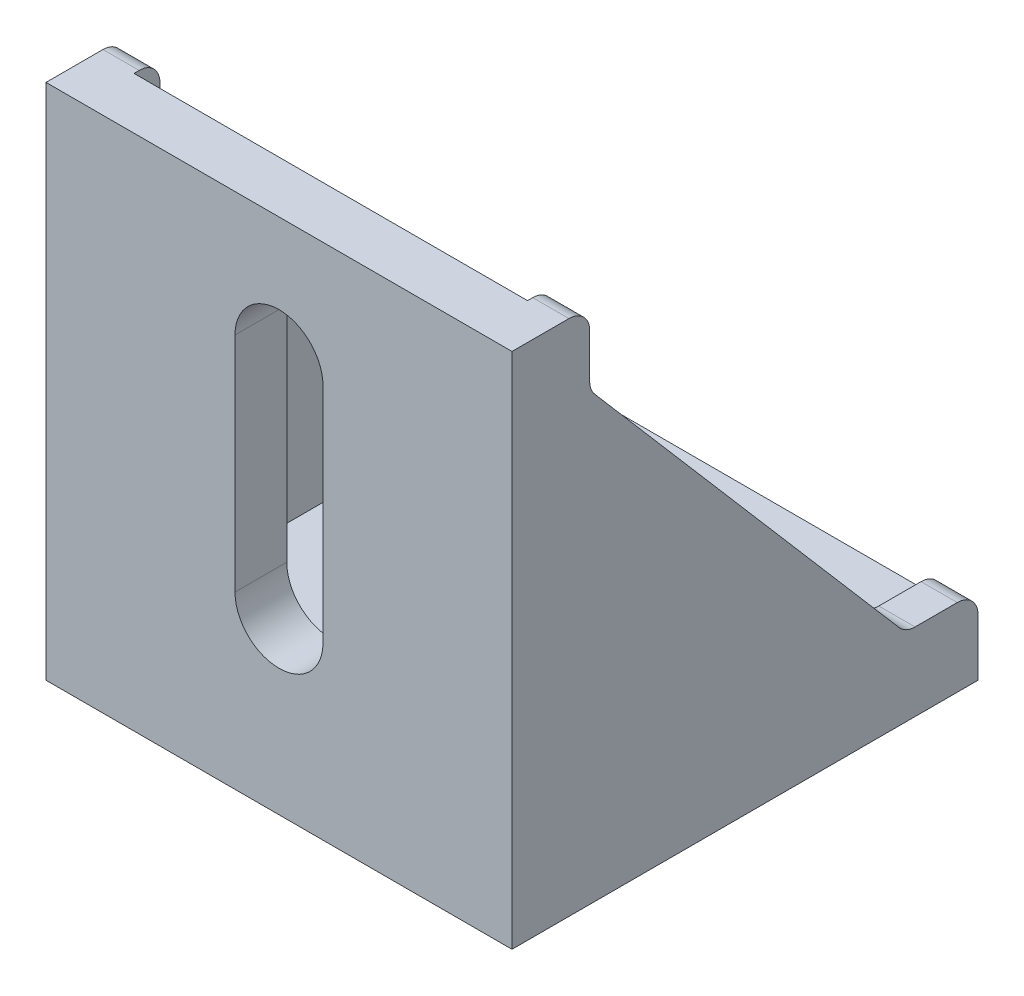
ISO-10303-21;
HEADER;
FILE_DESCRIPTION(('STEP AP214'),'2;1');
FILE_NAME('part.step','',(''),(''),'','','');
FILE_SCHEMA(('AUTOMOTIVE_DESIGN { 1 0 10303 214 1 1 1 1 }'));
ENDSEC;
DATA;
#1=APPLICATION_CONTEXT('core data for automotive mechanical design processes');
#2=APPLICATION_PROTOCOL_DEFINITION('international standard','automotive_design',2000,#1);
#3=PRODUCT_CONTEXT('',#1,'mechanical');
#4=PRODUCT('Part','Part','',(#3));
#5=PRODUCT_RELATED_PRODUCT_CATEGORY('part','',(#4));
#6=PRODUCT_DEFINITION_FORMATION('','',#4);
#7=PRODUCT_DEFINITION_CONTEXT('part definition',#1,'design');
#8=PRODUCT_DEFINITION('design','',#6,#7);
#9=PRODUCT_DEFINITION_SHAPE('','',#8);
#10=(LENGTH_UNIT() NAMED_UNIT(*) SI_UNIT(.MILLI.,.METRE.));
#11=(NAMED_UNIT(*) PLANE_ANGLE_UNIT() SI_UNIT($,.RADIAN.));
#12=(NAMED_UNIT(*) SI_UNIT($,.STERADIAN.) SOLID_ANGLE_UNIT());
#13=UNCERTAINTY_MEASURE_WITH_UNIT(LENGTH_MEASURE(1.E-05),#10,'distance_accuracy_value','');
#14=(GEOMETRIC_REPRESENTATION_CONTEXT(3) GLOBAL_UNCERTAINTY_ASSIGNED_CONTEXT((#13)) GLOBAL_UNIT_ASSIGNED_CONTEXT((#10,
#11,#12)) REPRESENTATION_CONTEXT('',''));
#15=CARTESIAN_POINT('',(0.,0.,0.));
#16=DIRECTION('',(0.,0.,1.));
#17=DIRECTION('',(1.,0.,0.));
#18=AXIS2_PLACEMENT_3D('',#15,#16,#17);
#19=CARTESIAN_POINT('',(45.,0.,-45.));
#20=DIRECTION('',(0.,-1.,0.));
#21=DIRECTION('',(0.,0.,-1.));
#22=AXIS2_PLACEMENT_3D('',#19,#20,#21);
#23=PLANE('',#22);
#24=DIRECTION('',(0.,0.,1.));
#25=VECTOR('',#24,1.);
#26=CARTESIAN_POINT('',(18.25,0.,-37.));
#27=LINE('',#26,#25);
#28=CARTESIAN_POINT('',(18.25,0.,-37.));
#29=VERTEX_POINT('',#28);
#30=CARTESIAN_POINT('',(18.25,0.,-15.5));
#31=VERTEX_POINT('',#30);
#32=EDGE_CURVE('E262',#29,#31,#27,.T.);
#33=ORIENTED_EDGE('',*,*,#32,.F.);
#34=CARTESIAN_POINT('',(22.5,0.,-37.));
#35=DIRECTION('',(0.,1.,0.));
#36=DIRECTION('',(0.,0.,1.));
#37=AXIS2_PLACEMENT_3D('',#34,#35,#36);
#38=CIRCLE('',#37,4.24999999999999);
#39=CARTESIAN_POINT('',(26.75,0.,-37.));
#40=VERTEX_POINT('',#39);
#41=EDGE_CURVE('E241',#40,#29,#38,.T.);
#42=ORIENTED_EDGE('',*,*,#41,.F.);
#43=DIRECTION('',(0.,0.,-1.));
#44=VECTOR('',#43,1.);
#45=CARTESIAN_POINT('',(26.75,0.,-37.));
#46=LINE('',#45,#44);
#47=CARTESIAN_POINT('',(26.75,0.,-15.5));
#48=VERTEX_POINT('',#47);
#49=EDGE_CURVE('E246',#48,#40,#46,.T.);
#50=ORIENTED_EDGE('',*,*,#49,.F.);
#51=CARTESIAN_POINT('',(22.5,0.,-15.5));
#52=DIRECTION('',(0.,1.,0.));
#53=DIRECTION('',(0.,0.,1.));
#54=AXIS2_PLACEMENT_3D('',#51,#52,#53);
#55=CIRCLE('',#54,4.24999999999999);
#56=EDGE_CURVE('E269',#31,#48,#55,.T.);
#57=ORIENTED_EDGE('',*,*,#56,.F.);
#58=EDGE_LOOP('',(#33,#42,#50,#57));
#59=FACE_BOUND('',#58,.T.);
#60=DIRECTION('',(0.,0.,-1.));
#61=VECTOR('',#60,1.);
#62=CARTESIAN_POINT('',(3.5,0.,-5.));
#63=LINE('',#62,#61);
#64=CARTESIAN_POINT('',(3.50000000000002,0.,-5.));
#65=VERTEX_POINT('',#64);
#66=CARTESIAN_POINT('',(3.50000000000002,0.,-45.));
#67=VERTEX_POINT('',#66);
#68=EDGE_CURVE('E309',#65,#67,#63,.T.);
#69=ORIENTED_EDGE('',*,*,#68,.F.);
#70=DIRECTION('',(-1.,0.,0.));
#71=VECTOR('',#70,1.);
#72=CARTESIAN_POINT('',(45.,0.,-5.));
#73=LINE('',#72,#71);
#74=CARTESIAN_POINT('',(41.5,0.,-5.));
#75=VERTEX_POINT('',#74);
#76=EDGE_CURVE('E389',#75,#65,#73,.T.);
#77=ORIENTED_EDGE('',*,*,#76,.F.);
#78=DIRECTION('',(0.,0.,-1.));
#79=VECTOR('',#78,1.);
#80=CARTESIAN_POINT('',(41.5,0.,-5.));
#81=LINE('',#80,#79);
#82=CARTESIAN_POINT('',(41.5,0.,-45.));
#83=VERTEX_POINT('',#82);
#84=EDGE_CURVE('E338',#75,#83,#81,.T.);
#85=ORIENTED_EDGE('',*,*,#84,.T.);
#86=DIRECTION('',(-1.,0.,0.));
#87=VECTOR('',#86,1.);
#88=CARTESIAN_POINT('',(45.,0.,-45.));
#89=LINE('',#88,#87);
#90=EDGE_CURVE('E392',#83,#67,#89,.T.);
#91=ORIENTED_EDGE('',*,*,#90,.T.);
#92=EDGE_LOOP('',(#69,#77,#85,#91));
#93=FACE_BOUND('',#92,.T.);
#94=ADVANCED_FACE('F37',(#59,#93),#23,.F.);
#95=CARTESIAN_POINT('',(45.,0.,-5.));
#96=DIRECTION('',(0.,0.,1.));
#97=DIRECTION('',(1.,0.,0.));
#98=AXIS2_PLACEMENT_3D('',#95,#96,#97);
#99=PLANE('',#98);
#100=DIRECTION('',(0.,-1.,0.));
#101=VECTOR('',#100,1.);
#102=CARTESIAN_POINT('',(26.75,33.,-5.));
#103=LINE('',#102,#101);
#104=CARTESIAN_POINT('',(26.75,33.,-5.));
#105=VERTEX_POINT('',#104);
#106=CARTESIAN_POINT('',(26.75,11.5,-5.));
#107=VERTEX_POINT('',#106);
#108=EDGE_CURVE('E287',#105,#107,#103,.T.);
#109=ORIENTED_EDGE('',*,*,#108,.F.);
#110=CARTESIAN_POINT('',(22.5,33.,-5.));
#111=DIRECTION('',(0.,0.,-1.));
#112=DIRECTION('',(-1.,0.,0.));
#113=AXIS2_PLACEMENT_3D('',#110,#111,#112);
#114=CIRCLE('',#113,4.25);
#115=CARTESIAN_POINT('',(18.25,33.,-5.));
#116=VERTEX_POINT('',#115);
#117=EDGE_CURVE('E285',#116,#105,#114,.T.);
#118=ORIENTED_EDGE('',*,*,#117,.F.);
#119=DIRECTION('',(0.,1.,0.));
#120=VECTOR('',#119,1.);
#121=CARTESIAN_POINT('',(18.25,33.,-5.));
#122=LINE('',#121,#120);
#123=CARTESIAN_POINT('',(18.25,11.5,-5.));
#124=VERTEX_POINT('',#123);
#125=EDGE_CURVE('E293',#124,#116,#122,.T.);
#126=ORIENTED_EDGE('',*,*,#125,.F.);
#127=CARTESIAN_POINT('',(22.5,11.5,-5.));
#128=DIRECTION('',(0.,0.,-1.));
#129=DIRECTION('',(-1.,0.,0.));
#130=AXIS2_PLACEMENT_3D('',#127,#128,#129);
#131=CIRCLE('',#130,4.25);
#132=EDGE_CURVE('E290',#107,#124,#131,.T.);
#133=ORIENTED_EDGE('',*,*,#132,.F.);
#134=EDGE_LOOP('',(#109,#118,#126,#133));
#135=FACE_BOUND('',#134,.T.);
#136=DIRECTION('',(0.,-1.,0.));
#137=VECTOR('',#136,1.);
#138=CARTESIAN_POINT('',(3.5,45.,-5.));
#139=LINE('',#138,#137);
#140=CARTESIAN_POINT('',(3.50000000000002,45.,-5.));
#141=VERTEX_POINT('',#140);
#142=EDGE_CURVE('E312',#141,#65,#139,.T.);
#143=ORIENTED_EDGE('',*,*,#142,.F.);
#144=DIRECTION('',(-1.,0.,0.));
#145=VECTOR('',#144,1.);
#146=CARTESIAN_POINT('',(45.,45.,-5.));
#147=LINE('',#146,#145);
#148=CARTESIAN_POINT('',(41.5,45.,-5.));
#149=VERTEX_POINT('',#148);
#150=EDGE_CURVE('E386',#149,#141,#147,.T.);
#151=ORIENTED_EDGE('',*,*,#150,.F.);
#152=DIRECTION('',(0.,-1.,0.));
#153=VECTOR('',#152,1.);
#154=CARTESIAN_POINT('',(41.5,45.,-5.));
#155=LINE('',#154,#153);
#156=EDGE_CURVE('E354',#149,#75,#155,.T.);
#157=ORIENTED_EDGE('',*,*,#156,.T.);
#158=ORIENTED_EDGE('',*,*,#76,.T.);
#159=EDGE_LOOP('',(#143,#151,#157,#158));
#160=FACE_BOUND('',#159,.T.);
#161=ADVANCED_FACE('F506',(#135,#160),#99,.F.);
#162=CARTESIAN_POINT('',(45.,-5.,0.));
#163=DIRECTION('',(0.,1.,0.));
#164=DIRECTION('',(0.,0.,1.));
#165=AXIS2_PLACEMENT_3D('',#162,#163,#164);
#166=PLANE('',#165);
#167=DIRECTION('',(0.,0.,1.));
#168=VECTOR('',#167,1.);
#169=CARTESIAN_POINT('',(26.75,-5.,-37.));
#170=LINE('',#169,#168);
#171=CARTESIAN_POINT('',(26.75,-5.,-37.));
#172=VERTEX_POINT('',#171);
#173=CARTESIAN_POINT('',(26.75,-5.,-15.5));
#174=VERTEX_POINT('',#173);
#175=EDGE_CURVE('E260',#172,#174,#170,.T.);
#176=ORIENTED_EDGE('',*,*,#175,.F.);
#177=CARTESIAN_POINT('',(22.5,-5.,-37.));
#178=DIRECTION('',(0.,1.,0.));
#179=DIRECTION('',(0.,0.,1.));
#180=AXIS2_PLACEMENT_3D('',#177,#178,#179);
#181=CIRCLE('',#180,4.24999999999999);
#182=CARTESIAN_POINT('',(18.25,-5.,-37.));
#183=VERTEX_POINT('',#182);
#184=EDGE_CURVE('E238',#183,#172,#181,.F.);
#185=ORIENTED_EDGE('',*,*,#184,.F.);
#186=DIRECTION('',(0.,0.,-1.));
#187=VECTOR('',#186,1.);
#188=CARTESIAN_POINT('',(18.25,-5.,-37.));
#189=LINE('',#188,#187);
#190=CARTESIAN_POINT('',(18.25,-5.,-15.5));
#191=VERTEX_POINT('',#190);
#192=EDGE_CURVE('E250',#191,#183,#189,.T.);
#193=ORIENTED_EDGE('',*,*,#192,.F.);
#194=CARTESIAN_POINT('',(22.5,-5.,-15.5));
#195=DIRECTION('',(0.,1.,0.));
#196=DIRECTION('',(0.,0.,1.));
#197=AXIS2_PLACEMENT_3D('',#194,#195,#196);
#198=CIRCLE('',#197,4.24999999999999);
#199=EDGE_CURVE('E264',#174,#191,#198,.F.);
#200=ORIENTED_EDGE('',*,*,#199,.F.);
#201=EDGE_LOOP('',(#176,#185,#193,#200));
#202=FACE_BOUND('',#201,.T.);
#203=DIRECTION('',(0.,0.,-1.));
#204=VECTOR('',#203,1.);
#205=CARTESIAN_POINT('',(0.,-5.,0.));
#206=LINE('',#205,#204);
#207=CARTESIAN_POINT('',(0.,-5.,0.));
#208=VERTEX_POINT('',#207);
#209=CARTESIAN_POINT('',(0.,-5.,-45.));
#210=VERTEX_POINT('',#209);
#211=EDGE_CURVE('E357',#208,#210,#206,.T.);
#212=ORIENTED_EDGE('',*,*,#211,.T.);
#213=DIRECTION('',(-1.,0.,0.));
#214=VECTOR('',#213,1.);
#215=CARTESIAN_POINT('',(45.,-5.,-45.));
#216=LINE('',#215,#214);
#217=CARTESIAN_POINT('',(45.,-5.,-45.));
#218=VERTEX_POINT('',#217);
#219=EDGE_CURVE('E394',#218,#210,#216,.T.);
#220=ORIENTED_EDGE('',*,*,#219,.F.);
#221=DIRECTION('',(0.,0.,-1.));
#222=VECTOR('',#221,1.);
#223=CARTESIAN_POINT('',(45.,-5.,0.));
#224=LINE('',#223,#222);
#225=CARTESIAN_POINT('',(45.,-5.,0.));
#226=VERTEX_POINT('',#225);
#227=EDGE_CURVE('E368',#226,#218,#224,.T.);
#228=ORIENTED_EDGE('',*,*,#227,.F.);
#229=DIRECTION('',(-1.,0.,0.));
#230=VECTOR('',#229,1.);
#231=CARTESIAN_POINT('',(45.,-5.,0.));
#232=LINE('',#231,#230);
#233=EDGE_CURVE('E397',#226,#208,#232,.T.);
#234=ORIENTED_EDGE('',*,*,#233,.T.);
#235=EDGE_LOOP('',(#212,#220,#228,#234));
#236=FACE_BOUND('',#235,.T.);
#237=ADVANCED_FACE('F257',(#202,#236),#166,.F.);
#238=CARTESIAN_POINT('',(45.,0.,-45.));
#239=DIRECTION('',(0.,0.,1.));
#240=DIRECTION('',(1.,0.,0.));
#241=AXIS2_PLACEMENT_3D('',#238,#239,#240);
#242=PLANE('',#241);
#243=DIRECTION('',(0.,1.,0.));
#244=VECTOR('',#243,1.);
#245=CARTESIAN_POINT('',(0.,0.,-45.));
#246=LINE('',#245,#244);
#247=CARTESIAN_POINT('',(0.,0.500000000000001,-45.));
#248=VERTEX_POINT('',#247);
#249=EDGE_CURVE('E378',#210,#248,#246,.T.);
#250=ORIENTED_EDGE('',*,*,#249,.T.);
#251=DIRECTION('',(-1.,0.,0.));
#252=VECTOR('',#251,1.);
#253=CARTESIAN_POINT('',(45.,0.500000000000001,-45.));
#254=LINE('',#253,#252);
#255=CARTESIAN_POINT('',(3.5,0.500000000000001,-45.));
#256=VERTEX_POINT('',#255);
#257=EDGE_CURVE('E453',#248,#256,#254,.F.);
#258=ORIENTED_EDGE('',*,*,#257,.T.);
#259=DIRECTION('',(0.,1.,0.));
#260=VECTOR('',#259,1.);
#261=CARTESIAN_POINT('',(3.5,0.,-45.));
#262=LINE('',#261,#260);
#263=EDGE_CURVE('E327',#67,#256,#262,.T.);
#264=ORIENTED_EDGE('',*,*,#263,.F.);
#265=ORIENTED_EDGE('',*,*,#90,.F.);
#266=DIRECTION('',(0.,1.,0.));
#267=VECTOR('',#266,1.);
#268=CARTESIAN_POINT('',(41.5,0.,-45.));
#269=LINE('',#268,#267);
#270=CARTESIAN_POINT('',(41.5,0.500000000000001,-45.));
#271=VERTEX_POINT('',#270);
#272=EDGE_CURVE('E341',#83,#271,#269,.T.);
#273=ORIENTED_EDGE('',*,*,#272,.T.);
#274=DIRECTION('',(1.,0.,0.));
#275=VECTOR('',#274,1.);
#276=CARTESIAN_POINT('',(45.,0.500000000000001,-45.));
#277=LINE('',#276,#275);
#278=CARTESIAN_POINT('',(45.,0.500000000000001,-45.));
#279=VERTEX_POINT('',#278);
#280=EDGE_CURVE('E450',#271,#279,#277,.T.);
#281=ORIENTED_EDGE('',*,*,#280,.T.);
#282=DIRECTION('',(0.,1.,0.));
#283=VECTOR('',#282,1.);
#284=CARTESIAN_POINT('',(45.,0.,-45.));
#285=LINE('',#284,#283);
#286=EDGE_CURVE('E371',#218,#279,#285,.T.);
#287=ORIENTED_EDGE('',*,*,#286,.F.);
#288=ORIENTED_EDGE('',*,*,#219,.T.);
#289=EDGE_LOOP('',(#250,#258,#264,#265,#273,#281,#287,#288));
#290=FACE_BOUND('',#289,.T.);
#291=ADVANCED_FACE('F513',(#290),#242,.F.);
#292=CARTESIAN_POINT('',(45.,45.,0.));
#293=DIRECTION('',(0.,-1.,0.));
#294=DIRECTION('',(0.,0.,-1.));
#295=AXIS2_PLACEMENT_3D('',#292,#293,#294);
#296=PLANE('',#295);
#297=DIRECTION('',(0.,0.,1.));
#298=VECTOR('',#297,1.);
#299=CARTESIAN_POINT('',(3.5,45.,-5.));
#300=LINE('',#299,#298);
#301=CARTESIAN_POINT('',(3.5,45.,-5.5));
#302=VERTEX_POINT('',#301);
#303=EDGE_CURVE('E316',#302,#141,#300,.T.);
#304=ORIENTED_EDGE('',*,*,#303,.F.);
#305=DIRECTION('',(-1.,0.,0.));
#306=VECTOR('',#305,1.);
#307=CARTESIAN_POINT('',(45.,45.,-5.5));
#308=LINE('',#307,#306);
#309=CARTESIAN_POINT('',(0.,45.,-5.5));
#310=VERTEX_POINT('',#309);
#311=EDGE_CURVE('E412',#302,#310,#308,.T.);
#312=ORIENTED_EDGE('',*,*,#311,.T.);
#313=DIRECTION('',(0.,0.,1.));
#314=VECTOR('',#313,1.);
#315=CARTESIAN_POINT('',(0.,45.,0.));
#316=LINE('',#315,#314);
#317=CARTESIAN_POINT('',(0.,45.,0.));
#318=VERTEX_POINT('',#317);
#319=EDGE_CURVE('E381',#310,#318,#316,.T.);
#320=ORIENTED_EDGE('',*,*,#319,.T.);
#321=DIRECTION('',(-1.,0.,0.));
#322=VECTOR('',#321,1.);
#323=CARTESIAN_POINT('',(45.,45.,0.));
#324=LINE('',#323,#322);
#325=CARTESIAN_POINT('',(45.,45.,0.));
#326=VERTEX_POINT('',#325);
#327=EDGE_CURVE('E376',#326,#318,#324,.T.);
#328=ORIENTED_EDGE('',*,*,#327,.F.);
#329=DIRECTION('',(0.,0.,1.));
#330=VECTOR('',#329,1.);
#331=CARTESIAN_POINT('',(45.,45.,0.));
#332=LINE('',#331,#330);
#333=CARTESIAN_POINT('',(45.,45.,-5.5));
#334=VERTEX_POINT('',#333);
#335=EDGE_CURVE('E374',#334,#326,#332,.T.);
#336=ORIENTED_EDGE('',*,*,#335,.F.);
#337=DIRECTION('',(1.,0.,0.));
#338=VECTOR('',#337,1.);
#339=CARTESIAN_POINT('',(41.5,45.,-5.5));
#340=LINE('',#339,#338);
#341=CARTESIAN_POINT('',(41.5,45.,-5.5));
#342=VERTEX_POINT('',#341);
#343=EDGE_CURVE('E410',#334,#342,#340,.F.);
#344=ORIENTED_EDGE('',*,*,#343,.T.);
#345=DIRECTION('',(0.,0.,1.));
#346=VECTOR('',#345,1.);
#347=CARTESIAN_POINT('',(41.5,45.,-5.));
#348=LINE('',#347,#346);
#349=EDGE_CURVE('E352',#342,#149,#348,.T.);
#350=ORIENTED_EDGE('',*,*,#349,.T.);
#351=ORIENTED_EDGE('',*,*,#150,.T.);
#352=EDGE_LOOP('',(#304,#312,#320,#328,#336,#344,#350,#351));
#353=FACE_BOUND('',#352,.T.);
#354=ADVANCED_FACE('F501',(#353),#296,.F.);
#355=CARTESIAN_POINT('',(45.,0.,0.));
#356=DIRECTION('',(0.,0.,-1.));
#357=DIRECTION('',(-1.,0.,0.));
#358=AXIS2_PLACEMENT_3D('',#355,#356,#357);
#359=PLANE('',#358);
#360=DIRECTION('',(0.,-1.,0.));
#361=VECTOR('',#360,1.);
#362=CARTESIAN_POINT('',(18.25,33.,0.));
#363=LINE('',#362,#361);
#364=CARTESIAN_POINT('',(18.25,33.,0.));
#365=VERTEX_POINT('',#364);
#366=CARTESIAN_POINT('',(18.25,11.5,0.));
#367=VERTEX_POINT('',#366);
#368=EDGE_CURVE('E279',#365,#367,#363,.T.);
#369=ORIENTED_EDGE('',*,*,#368,.F.);
#370=CARTESIAN_POINT('',(22.5,33.,0.));
#371=DIRECTION('',(0.,0.,-1.));
#372=DIRECTION('',(-1.,0.,0.));
#373=AXIS2_PLACEMENT_3D('',#370,#371,#372);
#374=CIRCLE('',#373,4.25);
#375=CARTESIAN_POINT('',(26.75,33.,0.));
#376=VERTEX_POINT('',#375);
#377=EDGE_CURVE('E282',#376,#365,#374,.F.);
#378=ORIENTED_EDGE('',*,*,#377,.F.);
#379=DIRECTION('',(0.,1.,0.));
#380=VECTOR('',#379,1.);
#381=CARTESIAN_POINT('',(26.75,33.,0.));
#382=LINE('',#381,#380);
#383=CARTESIAN_POINT('',(26.75,11.5,0.));
#384=VERTEX_POINT('',#383);
#385=EDGE_CURVE('E299',#384,#376,#382,.T.);
#386=ORIENTED_EDGE('',*,*,#385,.F.);
#387=CARTESIAN_POINT('',(22.5,11.5,0.));
#388=DIRECTION('',(0.,0.,-1.));
#389=DIRECTION('',(-1.,0.,0.));
#390=AXIS2_PLACEMENT_3D('',#387,#388,#389);
#391=CIRCLE('',#390,4.25);
#392=EDGE_CURVE('E254',#367,#384,#391,.F.);
#393=ORIENTED_EDGE('',*,*,#392,.F.);
#394=EDGE_LOOP('',(#369,#378,#386,#393));
#395=FACE_BOUND('',#394,.T.);
#396=DIRECTION('',(0.,-1.,0.));
#397=VECTOR('',#396,1.);
#398=CARTESIAN_POINT('',(0.,0.,0.));
#399=LINE('',#398,#397);
#400=EDGE_CURVE('E369',#318,#208,#399,.T.);
#401=ORIENTED_EDGE('',*,*,#400,.T.);
#402=ORIENTED_EDGE('',*,*,#233,.F.);
#403=DIRECTION('',(0.,-1.,0.));
#404=VECTOR('',#403,1.);
#405=CARTESIAN_POINT('',(45.,0.,0.));
#406=LINE('',#405,#404);
#407=EDGE_CURVE('E365',#326,#226,#406,.T.);
#408=ORIENTED_EDGE('',*,*,#407,.F.);
#409=ORIENTED_EDGE('',*,*,#327,.T.);
#410=EDGE_LOOP('',(#401,#402,#408,#409));
#411=FACE_BOUND('',#410,.T.);
#412=ADVANCED_FACE('F524',(#395,#411),#359,.F.);
#413=CARTESIAN_POINT('',(45.,0.,0.));
#414=DIRECTION('',(1.,0.,0.));
#415=DIRECTION('',(0.,0.,-1.));
#416=AXIS2_PLACEMENT_3D('',#413,#414,#415);
#417=PLANE('',#416);
#418=DIRECTION('',(0.,1.,0.));
#419=VECTOR('',#418,1.);
#420=CARTESIAN_POINT('',(45.,45.,-7.5));
#421=LINE('',#420,#419);
#422=CARTESIAN_POINT('',(45.,38.7411657505145,-7.5));
#423=VERTEX_POINT('',#422);
#424=CARTESIAN_POINT('',(45.,43.,-7.5));
#425=VERTEX_POINT('',#424);
#426=EDGE_CURVE('E342',#423,#425,#421,.T.);
#427=ORIENTED_EDGE('',*,*,#426,.T.);
#428=CARTESIAN_POINT('',(45.,43.,-5.5));
#429=DIRECTION('',(1.,0.,0.));
#430=DIRECTION('',(0.,0.,-1.));
#431=AXIS2_PLACEMENT_3D('',#428,#429,#430);
#432=CIRCLE('',#431,2.);
#433=EDGE_CURVE('E430',#425,#334,#432,.T.);
#434=ORIENTED_EDGE('',*,*,#433,.T.);
#435=ORIENTED_EDGE('',*,*,#335,.T.);
#436=ORIENTED_EDGE('',*,*,#407,.T.);
#437=ORIENTED_EDGE('',*,*,#227,.T.);
#438=ORIENTED_EDGE('',*,*,#286,.T.);
#439=CARTESIAN_POINT('',(45.,0.500000000000001,-43.));
#440=DIRECTION('',(1.,0.,0.));
#441=DIRECTION('',(0.,0.,-1.));
#442=AXIS2_PLACEMENT_3D('',#439,#440,#441);
#443=CIRCLE('',#442,2.);
#444=CARTESIAN_POINT('',(45.,2.5,-43.));
#445=VERTEX_POINT('',#444);
#446=EDGE_CURVE('E428',#279,#445,#443,.T.);
#447=ORIENTED_EDGE('',*,*,#446,.T.);
#448=DIRECTION('',(0.,0.,1.));
#449=VECTOR('',#448,1.);
#450=CARTESIAN_POINT('',(45.,2.5,-45.));
#451=LINE('',#450,#449);
#452=CARTESIAN_POINT('',(45.,2.5,-38.9184663490336));
#453=VERTEX_POINT('',#452);
#454=EDGE_CURVE('E330',#445,#453,#451,.T.);
#455=ORIENTED_EDGE('',*,*,#454,.T.);
#456=CARTESIAN_POINT('',(45.,4.5,-38.9184663490336));
#457=DIRECTION('',(1.,0.,0.));
#458=DIRECTION('',(0.,0.,-1.));
#459=AXIS2_PLACEMENT_3D('',#456,#457,#458);
#460=CIRCLE('',#459,2.);
#461=CARTESIAN_POINT('',(45.,3.19665855310836,-37.4014623698647));
#462=VERTEX_POINT('',#461);
#463=EDGE_CURVE('E463',#453,#462,#460,.F.);
#464=ORIENTED_EDGE('',*,*,#463,.T.);
#465=DIRECTION('',(0.,0.758501989584475,0.651670723445816));
#466=VECTOR('',#465,1.);
#467=CARTESIAN_POINT('',(45.,38.,-7.5));
#468=LINE('',#467,#466);
#469=CARTESIAN_POINT('',(45.,37.4378243036229,-7.98299602083105));
#470=VERTEX_POINT('',#469);
#471=EDGE_CURVE('E360',#462,#470,#468,.T.);
#472=ORIENTED_EDGE('',*,*,#471,.T.);
#473=CARTESIAN_POINT('',(45.,38.7411657505145,-9.5));
#474=DIRECTION('',(1.,0.,0.));
#475=DIRECTION('',(0.,0.,-1.));
#476=AXIS2_PLACEMENT_3D('',#473,#474,#475);
#477=CIRCLE('',#476,2.);
#478=EDGE_CURVE('E459',#470,#423,#477,.F.);
#479=ORIENTED_EDGE('',*,*,#478,.T.);
#480=EDGE_LOOP('',(#427,#434,#435,#436,#437,#438,#447,#455,#464,#472,#479));
#481=FACE_BOUND('',#480,.T.);
#482=ADVANCED_FACE('F554',(#481),#417,.T.);
#483=CARTESIAN_POINT('',(0.,0.,0.));
#484=DIRECTION('',(1.,0.,0.));
#485=DIRECTION('',(0.,0.,-1.));
#486=AXIS2_PLACEMENT_3D('',#483,#484,#485);
#487=PLANE('',#486);
#488=ORIENTED_EDGE('',*,*,#319,.F.);
#489=CARTESIAN_POINT('',(0.,43.,-5.5));
#490=DIRECTION('',(1.,0.,0.));
#491=DIRECTION('',(0.,0.,-1.));
#492=AXIS2_PLACEMENT_3D('',#489,#490,#491);
#493=CIRCLE('',#492,2.);
#494=CARTESIAN_POINT('',(0.,43.,-7.5));
#495=VERTEX_POINT('',#494);
#496=EDGE_CURVE('E417',#310,#495,#493,.F.);
#497=ORIENTED_EDGE('',*,*,#496,.T.);
#498=DIRECTION('',(0.,1.,0.));
#499=VECTOR('',#498,1.);
#500=CARTESIAN_POINT('',(0.,45.,-7.5));
#501=LINE('',#500,#499);
#502=CARTESIAN_POINT('',(0.,38.7411657505145,-7.5));
#503=VERTEX_POINT('',#502);
#504=EDGE_CURVE('E308',#503,#495,#501,.T.);
#505=ORIENTED_EDGE('',*,*,#504,.F.);
#506=CARTESIAN_POINT('',(0.,38.7411657505145,-9.5));
#507=DIRECTION('',(1.,0.,0.));
#508=DIRECTION('',(0.,0.,-1.));
#509=AXIS2_PLACEMENT_3D('',#506,#507,#508);
#510=CIRCLE('',#509,2.);
#511=CARTESIAN_POINT('',(0.,37.4378243036229,-7.98299602083105));
#512=VERTEX_POINT('',#511);
#513=EDGE_CURVE('E455',#503,#512,#510,.T.);
#514=ORIENTED_EDGE('',*,*,#513,.T.);
#515=DIRECTION('',(0.,0.758501989584475,0.651670723445816));
#516=VECTOR('',#515,1.);
#517=CARTESIAN_POINT('',(0.,38.,-7.5));
#518=LINE('',#517,#516);
#519=CARTESIAN_POINT('',(0.,3.19665855310836,-37.4014623698646));
#520=VERTEX_POINT('',#519);
#521=EDGE_CURVE('E333',#520,#512,#518,.T.);
#522=ORIENTED_EDGE('',*,*,#521,.F.);
#523=CARTESIAN_POINT('',(0.,4.5,-38.9184663490336));
#524=DIRECTION('',(1.,0.,0.));
#525=DIRECTION('',(0.,0.,-1.));
#526=AXIS2_PLACEMENT_3D('',#523,#524,#525);
#527=CIRCLE('',#526,2.);
#528=CARTESIAN_POINT('',(0.,2.5,-38.9184663490336));
#529=VERTEX_POINT('',#528);
#530=EDGE_CURVE('E45',#520,#529,#527,.T.);
#531=ORIENTED_EDGE('',*,*,#530,.T.);
#532=DIRECTION('',(0.,0.,1.));
#533=VECTOR('',#532,1.);
#534=CARTESIAN_POINT('',(0.,2.5,-45.));
#535=LINE('',#534,#533);
#536=CARTESIAN_POINT('',(0.,2.5,-43.));
#537=VERTEX_POINT('',#536);
#538=EDGE_CURVE('E313',#537,#529,#535,.T.);
#539=ORIENTED_EDGE('',*,*,#538,.F.);
#540=CARTESIAN_POINT('',(0.,0.500000000000001,-43.));
#541=DIRECTION('',(1.,0.,0.));
#542=DIRECTION('',(0.,0.,-1.));
#543=AXIS2_PLACEMENT_3D('',#540,#541,#542);
#544=CIRCLE('',#543,2.);
#545=EDGE_CURVE('E415',#537,#248,#544,.F.);
#546=ORIENTED_EDGE('',*,*,#545,.T.);
#547=ORIENTED_EDGE('',*,*,#249,.F.);
#548=ORIENTED_EDGE('',*,*,#211,.F.);
#549=ORIENTED_EDGE('',*,*,#400,.F.);
#550=EDGE_LOOP('',(#488,#497,#505,#514,#522,#531,#539,#546,#547,#548,#549));
#551=FACE_BOUND('',#550,.T.);
#552=ADVANCED_FACE('F469',(#551),#487,.F.);
#553=CARTESIAN_POINT('',(41.5,45.,-7.5));
#554=DIRECTION('',(0.,0.,-1.));
#555=DIRECTION('',(-1.,0.,0.));
#556=AXIS2_PLACEMENT_3D('',#553,#554,#555);
#557=PLANE('',#556);
#558=DIRECTION('',(0.,1.,0.));
#559=VECTOR('',#558,1.);
#560=CARTESIAN_POINT('',(41.5,45.,-7.5));
#561=LINE('',#560,#559);
#562=CARTESIAN_POINT('',(41.5,38.7411657505145,-7.5));
#563=VERTEX_POINT('',#562);
#564=CARTESIAN_POINT('',(41.5,43.,-7.5));
#565=VERTEX_POINT('',#564);
#566=EDGE_CURVE('E349',#563,#565,#561,.T.);
#567=ORIENTED_EDGE('',*,*,#566,.T.);
#568=DIRECTION('',(1.,0.,0.));
#569=VECTOR('',#568,1.);
#570=CARTESIAN_POINT('',(45.,43.,-7.5));
#571=LINE('',#570,#569);
#572=EDGE_CURVE('E425',#565,#425,#571,.T.);
#573=ORIENTED_EDGE('',*,*,#572,.T.);
#574=ORIENTED_EDGE('',*,*,#426,.F.);
#575=DIRECTION('',(1.,0.,0.));
#576=VECTOR('',#575,1.);
#577=CARTESIAN_POINT('',(41.5,38.7411657505145,-7.5));
#578=LINE('',#577,#576);
#579=EDGE_CURVE('E423',#423,#563,#578,.F.);
#580=ORIENTED_EDGE('',*,*,#579,.T.);
#581=EDGE_LOOP('',(#567,#573,#574,#580));
#582=FACE_BOUND('',#581,.T.);
#583=ADVANCED_FACE('F537',(#582),#557,.T.);
#584=CARTESIAN_POINT('',(41.5,38.,-7.5));
#585=DIRECTION('',(0.,0.651670723445816,-0.758501989584475));
#586=DIRECTION('',(0.,0.758501989584475,0.651670723445816));
#587=AXIS2_PLACEMENT_3D('',#584,#585,#586);
#588=PLANE('',#587);
#589=DIRECTION('',(0.,0.758501989584475,0.651670723445816));
#590=VECTOR('',#589,1.);
#591=CARTESIAN_POINT('',(41.5,38.,-7.5));
#592=LINE('',#591,#590);
#593=CARTESIAN_POINT('',(41.5,3.19665855310836,-37.4014623698647));
#594=VERTEX_POINT('',#593);
#595=CARTESIAN_POINT('',(41.5,37.4378243036229,-7.98299602083105));
#596=VERTEX_POINT('',#595);
#597=EDGE_CURVE('E346',#594,#596,#592,.T.);
#598=ORIENTED_EDGE('',*,*,#597,.T.);
#599=DIRECTION('',(1.,0.,0.));
#600=VECTOR('',#599,1.);
#601=CARTESIAN_POINT('',(45.,37.4378243036229,-7.98299602083105));
#602=LINE('',#601,#600);
#603=EDGE_CURVE('E437',#596,#470,#602,.T.);
#604=ORIENTED_EDGE('',*,*,#603,.T.);
#605=ORIENTED_EDGE('',*,*,#471,.F.);
#606=DIRECTION('',(1.,0.,0.));
#607=VECTOR('',#606,1.);
#608=CARTESIAN_POINT('',(41.5,3.19665855310836,-37.4014623698646));
#609=LINE('',#608,#607);
#610=EDGE_CURVE('E435',#462,#594,#609,.F.);
#611=ORIENTED_EDGE('',*,*,#610,.T.);
#612=EDGE_LOOP('',(#598,#604,#605,#611));
#613=FACE_BOUND('',#612,.T.);
#614=ADVANCED_FACE('F544',(#613),#588,.T.);
#615=CARTESIAN_POINT('',(41.5,2.5,-45.));
#616=DIRECTION('',(0.,1.,0.));
#617=DIRECTION('',(0.,0.,1.));
#618=AXIS2_PLACEMENT_3D('',#615,#616,#617);
#619=PLANE('',#618);
#620=DIRECTION('',(0.,0.,1.));
#621=VECTOR('',#620,1.);
#622=CARTESIAN_POINT('',(41.5,2.5,-45.));
#623=LINE('',#622,#621);
#624=CARTESIAN_POINT('',(41.5,2.5,-43.));
#625=VERTEX_POINT('',#624);
#626=CARTESIAN_POINT('',(41.5,2.5,-38.9184663490336));
#627=VERTEX_POINT('',#626);
#628=EDGE_CURVE('E344',#625,#627,#623,.T.);
#629=ORIENTED_EDGE('',*,*,#628,.T.);
#630=DIRECTION('',(1.,0.,0.));
#631=VECTOR('',#630,1.);
#632=CARTESIAN_POINT('',(45.,2.5,-38.9184663490336));
#633=LINE('',#632,#631);
#634=EDGE_CURVE('E442',#627,#453,#633,.T.);
#635=ORIENTED_EDGE('',*,*,#634,.T.);
#636=ORIENTED_EDGE('',*,*,#454,.F.);
#637=DIRECTION('',(1.,0.,0.));
#638=VECTOR('',#637,1.);
#639=CARTESIAN_POINT('',(41.5,2.5,-43.));
#640=LINE('',#639,#638);
#641=EDGE_CURVE('E440',#445,#625,#640,.F.);
#642=ORIENTED_EDGE('',*,*,#641,.T.);
#643=EDGE_LOOP('',(#629,#635,#636,#642));
#644=FACE_BOUND('',#643,.T.);
#645=ADVANCED_FACE('F552',(#644),#619,.T.);
#646=CARTESIAN_POINT('',(41.5,0.,0.));
#647=DIRECTION('',(1.,0.,0.));
#648=DIRECTION('',(0.,0.,-1.));
#649=AXIS2_PLACEMENT_3D('',#646,#647,#648);
#650=PLANE('',#649);
#651=ORIENTED_EDGE('',*,*,#349,.F.);
#652=CARTESIAN_POINT('',(41.5,43.,-5.5));
#653=DIRECTION('',(1.,0.,0.));
#654=DIRECTION('',(0.,0.,-1.));
#655=AXIS2_PLACEMENT_3D('',#652,#653,#654);
#656=CIRCLE('',#655,2.);
#657=EDGE_CURVE('E433',#342,#565,#656,.F.);
#658=ORIENTED_EDGE('',*,*,#657,.T.);
#659=ORIENTED_EDGE('',*,*,#566,.F.);
#660=CARTESIAN_POINT('',(41.5,38.7411657505145,-9.5));
#661=DIRECTION('',(1.,0.,0.));
#662=DIRECTION('',(0.,0.,-1.));
#663=AXIS2_PLACEMENT_3D('',#660,#661,#662);
#664=CIRCLE('',#663,2.);
#665=EDGE_CURVE('E461',#563,#596,#664,.T.);
#666=ORIENTED_EDGE('',*,*,#665,.T.);
#667=ORIENTED_EDGE('',*,*,#597,.F.);
#668=CARTESIAN_POINT('',(41.5,4.5,-38.9184663490336));
#669=DIRECTION('',(1.,0.,0.));
#670=DIRECTION('',(0.,0.,-1.));
#671=AXIS2_PLACEMENT_3D('',#668,#669,#670);
#672=CIRCLE('',#671,2.);
#673=EDGE_CURVE('E58',#594,#627,#672,.T.);
#674=ORIENTED_EDGE('',*,*,#673,.T.);
#675=ORIENTED_EDGE('',*,*,#628,.F.);
#676=CARTESIAN_POINT('',(41.5,0.500000000000001,-43.));
#677=DIRECTION('',(1.,0.,0.));
#678=DIRECTION('',(0.,0.,-1.));
#679=AXIS2_PLACEMENT_3D('',#676,#677,#678);
#680=CIRCLE('',#679,2.);
#681=EDGE_CURVE('E52',#625,#271,#680,.F.);
#682=ORIENTED_EDGE('',*,*,#681,.T.);
#683=ORIENTED_EDGE('',*,*,#272,.F.);
#684=ORIENTED_EDGE('',*,*,#84,.F.);
#685=ORIENTED_EDGE('',*,*,#156,.F.);
#686=EDGE_LOOP('',(#651,#658,#659,#666,#667,#674,#675,#682,#683,#684,#685));
#687=FACE_BOUND('',#686,.T.);
#688=ADVANCED_FACE('F534',(#687),#650,.F.);
#689=CARTESIAN_POINT('',(3.5,2.5,-45.));
#690=DIRECTION('',(0.,-1.,0.));
#691=DIRECTION('',(0.,0.,-1.));
#692=AXIS2_PLACEMENT_3D('',#689,#690,#691);
#693=PLANE('',#692);
#694=ORIENTED_EDGE('',*,*,#538,.T.);
#695=DIRECTION('',(-1.,0.,0.));
#696=VECTOR('',#695,1.);
#697=CARTESIAN_POINT('',(3.5,2.5,-38.9184663490336));
#698=LINE('',#697,#696);
#699=CARTESIAN_POINT('',(3.5,2.5,-38.9184663490336));
#700=VERTEX_POINT('',#699);
#701=EDGE_CURVE('E448',#529,#700,#698,.F.);
#702=ORIENTED_EDGE('',*,*,#701,.T.);
#703=DIRECTION('',(0.,0.,1.));
#704=VECTOR('',#703,1.);
#705=CARTESIAN_POINT('',(3.5,2.5,-45.));
#706=LINE('',#705,#704);
#707=CARTESIAN_POINT('',(3.5,2.5,-43.));
#708=VERTEX_POINT('',#707);
#709=EDGE_CURVE('E324',#708,#700,#706,.T.);
#710=ORIENTED_EDGE('',*,*,#709,.F.);
#711=DIRECTION('',(-1.,0.,0.));
#712=VECTOR('',#711,1.);
#713=CARTESIAN_POINT('',(3.5,2.5,-43.));
#714=LINE('',#713,#712);
#715=EDGE_CURVE('E445',#708,#537,#714,.T.);
#716=ORIENTED_EDGE('',*,*,#715,.T.);
#717=EDGE_LOOP('',(#694,#702,#710,#716));
#718=FACE_BOUND('',#717,.T.);
#719=ADVANCED_FACE('F474',(#718),#693,.F.);
#720=CARTESIAN_POINT('',(3.5,38.,-7.5));
#721=DIRECTION('',(0.,-0.651670723445816,0.758501989584475));
#722=DIRECTION('',(0.,-0.758501989584475,-0.651670723445816));
#723=AXIS2_PLACEMENT_3D('',#720,#721,#722);
#724=PLANE('',#723);
#725=ORIENTED_EDGE('',*,*,#521,.T.);
#726=DIRECTION('',(-1.,0.,0.));
#727=VECTOR('',#726,1.);
#728=CARTESIAN_POINT('',(3.5,37.4378243036229,-7.98299602083105));
#729=LINE('',#728,#727);
#730=CARTESIAN_POINT('',(3.5,37.4378243036229,-7.98299602083105));
#731=VERTEX_POINT('',#730);
#732=EDGE_CURVE('E408',#512,#731,#729,.F.);
#733=ORIENTED_EDGE('',*,*,#732,.T.);
#734=DIRECTION('',(0.,0.758501989584475,0.651670723445816));
#735=VECTOR('',#734,1.);
#736=CARTESIAN_POINT('',(3.5,38.,-7.5));
#737=LINE('',#736,#735);
#738=CARTESIAN_POINT('',(3.5,3.19665855310836,-37.4014623698646));
#739=VERTEX_POINT('',#738);
#740=EDGE_CURVE('E321',#739,#731,#737,.T.);
#741=ORIENTED_EDGE('',*,*,#740,.F.);
#742=DIRECTION('',(-1.,0.,0.));
#743=VECTOR('',#742,1.);
#744=CARTESIAN_POINT('',(0.,3.19665855310837,-37.4014623698646));
#745=LINE('',#744,#743);
#746=EDGE_CURVE('E405',#739,#520,#745,.T.);
#747=ORIENTED_EDGE('',*,*,#746,.T.);
#748=EDGE_LOOP('',(#725,#733,#741,#747));
#749=FACE_BOUND('',#748,.T.);
#750=ADVANCED_FACE('F484',(#749),#724,.F.);
#751=CARTESIAN_POINT('',(3.5,45.,-7.5));
#752=DIRECTION('',(0.,0.,1.));
#753=DIRECTION('',(1.,0.,0.));
#754=AXIS2_PLACEMENT_3D('',#751,#752,#753);
#755=PLANE('',#754);
#756=DIRECTION('',(0.,1.,0.));
#757=VECTOR('',#756,1.);
#758=CARTESIAN_POINT('',(3.5,45.,-7.5));
#759=LINE('',#758,#757);
#760=CARTESIAN_POINT('',(3.5,38.7411657505145,-7.5));
#761=VERTEX_POINT('',#760);
#762=CARTESIAN_POINT('',(3.5,43.,-7.5));
#763=VERTEX_POINT('',#762);
#764=EDGE_CURVE('E318',#761,#763,#759,.T.);
#765=ORIENTED_EDGE('',*,*,#764,.F.);
#766=DIRECTION('',(-1.,0.,0.));
#767=VECTOR('',#766,1.);
#768=CARTESIAN_POINT('',(0.,38.7411657505145,-7.5));
#769=LINE('',#768,#767);
#770=EDGE_CURVE('E402',#761,#503,#769,.T.);
#771=ORIENTED_EDGE('',*,*,#770,.T.);
#772=ORIENTED_EDGE('',*,*,#504,.T.);
#773=DIRECTION('',(-1.,0.,0.));
#774=VECTOR('',#773,1.);
#775=CARTESIAN_POINT('',(3.5,43.,-7.5));
#776=LINE('',#775,#774);
#777=EDGE_CURVE('E400',#495,#763,#776,.F.);
#778=ORIENTED_EDGE('',*,*,#777,.T.);
#779=EDGE_LOOP('',(#765,#771,#772,#778));
#780=FACE_BOUND('',#779,.T.);
#781=ADVANCED_FACE('F492',(#780),#755,.F.);
#782=CARTESIAN_POINT('',(3.5,0.,0.));
#783=DIRECTION('',(-1.,0.,0.));
#784=DIRECTION('',(0.,0.,-1.));
#785=AXIS2_PLACEMENT_3D('',#782,#783,#784);
#786=PLANE('',#785);
#787=ORIENTED_EDGE('',*,*,#764,.T.);
#788=CARTESIAN_POINT('',(3.5,43.,-5.5));
#789=DIRECTION('',(-1.,0.,0.));
#790=DIRECTION('',(0.,0.,1.));
#791=AXIS2_PLACEMENT_3D('',#788,#789,#790);
#792=CIRCLE('',#791,2.);
#793=EDGE_CURVE('E421',#763,#302,#792,.F.);
#794=ORIENTED_EDGE('',*,*,#793,.T.);
#795=ORIENTED_EDGE('',*,*,#303,.T.);
#796=ORIENTED_EDGE('',*,*,#142,.T.);
#797=ORIENTED_EDGE('',*,*,#68,.T.);
#798=ORIENTED_EDGE('',*,*,#263,.T.);
#799=CARTESIAN_POINT('',(3.5,0.500000000000001,-43.));
#800=DIRECTION('',(-1.,0.,0.));
#801=DIRECTION('',(0.,0.,1.));
#802=AXIS2_PLACEMENT_3D('',#799,#800,#801);
#803=CIRCLE('',#802,2.);
#804=EDGE_CURVE('E419',#256,#708,#803,.F.);
#805=ORIENTED_EDGE('',*,*,#804,.T.);
#806=ORIENTED_EDGE('',*,*,#709,.T.);
#807=CARTESIAN_POINT('',(3.5,4.5,-38.9184663490336));
#808=DIRECTION('',(-1.,0.,0.));
#809=DIRECTION('',(0.,0.,1.));
#810=AXIS2_PLACEMENT_3D('',#807,#808,#809);
#811=CIRCLE('',#810,2.);
#812=EDGE_CURVE('E11',#700,#739,#811,.T.);
#813=ORIENTED_EDGE('',*,*,#812,.T.);
#814=ORIENTED_EDGE('',*,*,#740,.T.);
#815=CARTESIAN_POINT('',(3.5,38.7411657505145,-9.5));
#816=DIRECTION('',(-1.,0.,0.));
#817=DIRECTION('',(0.,0.,1.));
#818=AXIS2_PLACEMENT_3D('',#815,#816,#817);
#819=CIRCLE('',#818,2.);
#820=EDGE_CURVE('E457',#731,#761,#819,.T.);
#821=ORIENTED_EDGE('',*,*,#820,.T.);
#822=EDGE_LOOP('',(#787,#794,#795,#796,#797,#798,#805,#806,#813,#814,#821));
#823=FACE_BOUND('',#822,.T.);
#824=ADVANCED_FACE('F481',(#823),#786,.F.);
#825=CARTESIAN_POINT('',(22.5,33.,0.00100000000000013));
#826=DIRECTION('',(0.,0.,-1.));
#827=DIRECTION('',(-1.,0.,0.));
#828=AXIS2_PLACEMENT_3D('',#825,#826,#827);
#829=CYLINDRICAL_SURFACE('',#828,4.25);
#830=ORIENTED_EDGE('',*,*,#377,.T.);
#831=DIRECTION('',(0.,0.,-1.));
#832=VECTOR('',#831,1.);
#833=CARTESIAN_POINT('',(18.25,33.,0.00100000000000013));
#834=LINE('',#833,#832);
#835=EDGE_CURVE('E297',#365,#116,#834,.T.);
#836=ORIENTED_EDGE('',*,*,#835,.T.);
#837=ORIENTED_EDGE('',*,*,#117,.T.);
#838=DIRECTION('',(0.,0.,-1.));
#839=VECTOR('',#838,1.);
#840=CARTESIAN_POINT('',(26.75,33.,0.00100000000000013));
#841=LINE('',#840,#839);
#842=EDGE_CURVE('E296',#376,#105,#841,.T.);
#843=ORIENTED_EDGE('',*,*,#842,.F.);
#844=EDGE_LOOP('',(#830,#836,#837,#843));
#845=FACE_BOUND('',#844,.T.);
#846=ADVANCED_FACE('F689',(#845),#829,.F.);
#847=CARTESIAN_POINT('',(18.25,33.,0.00100000000000013));
#848=DIRECTION('',(-1.,0.,0.));
#849=DIRECTION('',(0.,-1.,0.));
#850=AXIS2_PLACEMENT_3D('',#847,#848,#849);
#851=PLANE('',#850);
#852=ORIENTED_EDGE('',*,*,#368,.T.);
#853=DIRECTION('',(0.,0.,-1.));
#854=VECTOR('',#853,1.);
#855=CARTESIAN_POINT('',(18.25,11.5,0.00100000000000013));
#856=LINE('',#855,#854);
#857=EDGE_CURVE('E300',#367,#124,#856,.T.);
#858=ORIENTED_EDGE('',*,*,#857,.T.);
#859=ORIENTED_EDGE('',*,*,#125,.T.);
#860=ORIENTED_EDGE('',*,*,#835,.F.);
#861=EDGE_LOOP('',(#852,#858,#859,#860));
#862=FACE_BOUND('',#861,.T.);
#863=ADVANCED_FACE('F680',(#862),#851,.F.);
#864=CARTESIAN_POINT('',(22.5,11.5,0.00100000000000013));
#865=DIRECTION('',(0.,0.,-1.));
#866=DIRECTION('',(-1.,0.,0.));
#867=AXIS2_PLACEMENT_3D('',#864,#865,#866);
#868=CYLINDRICAL_SURFACE('',#867,4.25);
#869=ORIENTED_EDGE('',*,*,#392,.T.);
#870=DIRECTION('',(0.,0.,-1.));
#871=VECTOR('',#870,1.);
#872=CARTESIAN_POINT('',(26.75,11.5,0.00100000000000013));
#873=LINE('',#872,#871);
#874=EDGE_CURVE('E302',#384,#107,#873,.T.);
#875=ORIENTED_EDGE('',*,*,#874,.T.);
#876=ORIENTED_EDGE('',*,*,#132,.T.);
#877=ORIENTED_EDGE('',*,*,#857,.F.);
#878=EDGE_LOOP('',(#869,#875,#876,#877));
#879=FACE_BOUND('',#878,.T.);
#880=ADVANCED_FACE('F671',(#879),#868,.F.);
#881=CARTESIAN_POINT('',(26.75,33.,0.00100000000000013));
#882=DIRECTION('',(1.,0.,0.));
#883=DIRECTION('',(0.,0.,-1.));
#884=AXIS2_PLACEMENT_3D('',#881,#882,#883);
#885=PLANE('',#884);
#886=ORIENTED_EDGE('',*,*,#385,.T.);
#887=ORIENTED_EDGE('',*,*,#842,.T.);
#888=ORIENTED_EDGE('',*,*,#108,.T.);
#889=ORIENTED_EDGE('',*,*,#874,.F.);
#890=EDGE_LOOP('',(#886,#887,#888,#889));
#891=FACE_BOUND('',#890,.T.);
#892=ADVANCED_FACE('F662',(#891),#885,.F.);
#893=CARTESIAN_POINT('',(22.5,-5.001,-37.));
#894=DIRECTION('',(0.,1.,0.));
#895=DIRECTION('',(0.,0.,1.));
#896=AXIS2_PLACEMENT_3D('',#893,#894,#895);
#897=CYLINDRICAL_SURFACE('',#896,4.24999999999999);
#898=ORIENTED_EDGE('',*,*,#184,.T.);
#899=DIRECTION('',(0.,1.,0.));
#900=VECTOR('',#899,1.);
#901=CARTESIAN_POINT('',(26.75,-5.001,-37.));
#902=LINE('',#901,#900);
#903=EDGE_CURVE('E255',#172,#40,#902,.T.);
#904=ORIENTED_EDGE('',*,*,#903,.T.);
#905=ORIENTED_EDGE('',*,*,#41,.T.);
#906=DIRECTION('',(0.,1.,0.));
#907=VECTOR('',#906,1.);
#908=CARTESIAN_POINT('',(18.25,-5.001,-37.));
#909=LINE('',#908,#907);
#910=EDGE_CURVE('E234',#183,#29,#909,.T.);
#911=ORIENTED_EDGE('',*,*,#910,.F.);
#912=EDGE_LOOP('',(#898,#904,#905,#911));
#913=FACE_BOUND('',#912,.T.);
#914=ADVANCED_FACE('F236',(#913),#897,.F.);
#915=CARTESIAN_POINT('',(26.75,-5.001,-37.));
#916=DIRECTION('',(1.,0.,0.));
#917=DIRECTION('',(0.,0.,-1.));
#918=AXIS2_PLACEMENT_3D('',#915,#916,#917);
#919=PLANE('',#918);
#920=ORIENTED_EDGE('',*,*,#175,.T.);
#921=DIRECTION('',(0.,1.,0.));
#922=VECTOR('',#921,1.);
#923=CARTESIAN_POINT('',(26.75,-5.001,-15.5));
#924=LINE('',#923,#922);
#925=EDGE_CURVE('E275',#174,#48,#924,.T.);
#926=ORIENTED_EDGE('',*,*,#925,.T.);
#927=ORIENTED_EDGE('',*,*,#49,.T.);
#928=ORIENTED_EDGE('',*,*,#903,.F.);
#929=EDGE_LOOP('',(#920,#926,#927,#928));
#930=FACE_BOUND('',#929,.T.);
#931=ADVANCED_FACE('F645',(#930),#919,.F.);
#932=CARTESIAN_POINT('',(22.5,-5.001,-15.5));
#933=DIRECTION('',(0.,1.,0.));
#934=DIRECTION('',(0.,0.,1.));
#935=AXIS2_PLACEMENT_3D('',#932,#933,#934);
#936=CYLINDRICAL_SURFACE('',#935,4.24999999999999);
#937=ORIENTED_EDGE('',*,*,#199,.T.);
#938=DIRECTION('',(0.,1.,0.));
#939=VECTOR('',#938,1.);
#940=CARTESIAN_POINT('',(18.25,-5.001,-15.5));
#941=LINE('',#940,#939);
#942=EDGE_CURVE('E245',#191,#31,#941,.T.);
#943=ORIENTED_EDGE('',*,*,#942,.T.);
#944=ORIENTED_EDGE('',*,*,#56,.T.);
#945=ORIENTED_EDGE('',*,*,#925,.F.);
#946=EDGE_LOOP('',(#937,#943,#944,#945));
#947=FACE_BOUND('',#946,.T.);
#948=ADVANCED_FACE('F636',(#947),#936,.F.);
#949=CARTESIAN_POINT('',(18.25,-5.001,-37.));
#950=DIRECTION('',(-1.,0.,0.));
#951=DIRECTION('',(0.,0.,1.));
#952=AXIS2_PLACEMENT_3D('',#949,#950,#951);
#953=PLANE('',#952);
#954=ORIENTED_EDGE('',*,*,#192,.T.);
#955=ORIENTED_EDGE('',*,*,#910,.T.);
#956=ORIENTED_EDGE('',*,*,#32,.T.);
#957=ORIENTED_EDGE('',*,*,#942,.F.);
#958=EDGE_LOOP('',(#954,#955,#956,#957));
#959=FACE_BOUND('',#958,.T.);
#960=ADVANCED_FACE('F251',(#959),#953,.F.);
#961=CARTESIAN_POINT('',(3.5,38.7411657505145,-9.5));
#962=DIRECTION('',(1.,0.,0.));
#963=DIRECTION('',(0.,0.,-1.));
#964=AXIS2_PLACEMENT_3D('',#961,#962,#963);
#965=CYLINDRICAL_SURFACE('',#964,2.);
#966=ORIENTED_EDGE('',*,*,#820,.F.);
#967=ORIENTED_EDGE('',*,*,#732,.F.);
#968=ORIENTED_EDGE('',*,*,#513,.F.);
#969=ORIENTED_EDGE('',*,*,#770,.F.);
#970=EDGE_LOOP('',(#966,#967,#968,#969));
#971=FACE_BOUND('',#970,.T.);
#972=ADVANCED_FACE('F487',(#971),#965,.F.);
#973=CARTESIAN_POINT('',(45.,43.,-5.5));
#974=DIRECTION('',(-1.,0.,0.));
#975=DIRECTION('',(0.,0.,1.));
#976=AXIS2_PLACEMENT_3D('',#973,#974,#975);
#977=CYLINDRICAL_SURFACE('',#976,2.);
#978=ORIENTED_EDGE('',*,*,#793,.F.);
#979=ORIENTED_EDGE('',*,*,#777,.F.);
#980=ORIENTED_EDGE('',*,*,#496,.F.);
#981=ORIENTED_EDGE('',*,*,#311,.F.);
#982=EDGE_LOOP('',(#978,#979,#980,#981));
#983=FACE_BOUND('',#982,.T.);
#984=ADVANCED_FACE('F496',(#983),#977,.T.);
#985=CARTESIAN_POINT('',(41.5,43.,-5.5));
#986=DIRECTION('',(-1.,0.,0.));
#987=DIRECTION('',(0.,0.,1.));
#988=AXIS2_PLACEMENT_3D('',#985,#986,#987);
#989=CYLINDRICAL_SURFACE('',#988,2.);
#990=ORIENTED_EDGE('',*,*,#657,.F.);
#991=ORIENTED_EDGE('',*,*,#343,.F.);
#992=ORIENTED_EDGE('',*,*,#433,.F.);
#993=ORIENTED_EDGE('',*,*,#572,.F.);
#994=EDGE_LOOP('',(#990,#991,#992,#993));
#995=FACE_BOUND('',#994,.T.);
#996=ADVANCED_FACE('F531',(#995),#989,.T.);
#997=CARTESIAN_POINT('',(41.5,38.7411657505145,-9.5));
#998=DIRECTION('',(-1.,0.,0.));
#999=DIRECTION('',(0.,0.,1.));
#1000=AXIS2_PLACEMENT_3D('',#997,#998,#999);
#1001=CYLINDRICAL_SURFACE('',#1000,2.);
#1002=ORIENTED_EDGE('',*,*,#665,.F.);
#1003=ORIENTED_EDGE('',*,*,#579,.F.);
#1004=ORIENTED_EDGE('',*,*,#478,.F.);
#1005=ORIENTED_EDGE('',*,*,#603,.F.);
#1006=EDGE_LOOP('',(#1002,#1003,#1004,#1005));
#1007=FACE_BOUND('',#1006,.T.);
#1008=ADVANCED_FACE('F541',(#1007),#1001,.F.);
#1009=CARTESIAN_POINT('',(41.5,4.5,-38.9184663490336));
#1010=DIRECTION('',(-1.,0.,0.));
#1011=DIRECTION('',(0.,0.,1.));
#1012=AXIS2_PLACEMENT_3D('',#1009,#1010,#1011);
#1013=CYLINDRICAL_SURFACE('',#1012,2.);
#1014=ORIENTED_EDGE('',*,*,#673,.F.);
#1015=ORIENTED_EDGE('',*,*,#610,.F.);
#1016=ORIENTED_EDGE('',*,*,#463,.F.);
#1017=ORIENTED_EDGE('',*,*,#634,.F.);
#1018=EDGE_LOOP('',(#1014,#1015,#1016,#1017));
#1019=FACE_BOUND('',#1018,.T.);
#1020=ADVANCED_FACE('F548',(#1019),#1013,.F.);
#1021=CARTESIAN_POINT('',(3.5,4.5,-38.9184663490336));
#1022=DIRECTION('',(1.,0.,0.));
#1023=DIRECTION('',(0.,0.,-1.));
#1024=AXIS2_PLACEMENT_3D('',#1021,#1022,#1023);
#1025=CYLINDRICAL_SURFACE('',#1024,2.);
#1026=ORIENTED_EDGE('',*,*,#812,.F.);
#1027=ORIENTED_EDGE('',*,*,#701,.F.);
#1028=ORIENTED_EDGE('',*,*,#530,.F.);
#1029=ORIENTED_EDGE('',*,*,#746,.F.);
#1030=EDGE_LOOP('',(#1026,#1027,#1028,#1029));
#1031=FACE_BOUND('',#1030,.T.);
#1032=ADVANCED_FACE('F478',(#1031),#1025,.F.);
#1033=CARTESIAN_POINT('',(3.5,0.500000000000001,-43.));
#1034=DIRECTION('',(-1.,0.,0.));
#1035=DIRECTION('',(0.,0.,1.));
#1036=AXIS2_PLACEMENT_3D('',#1033,#1034,#1035);
#1037=CYLINDRICAL_SURFACE('',#1036,2.);
#1038=ORIENTED_EDGE('',*,*,#804,.F.);
#1039=ORIENTED_EDGE('',*,*,#257,.F.);
#1040=ORIENTED_EDGE('',*,*,#545,.F.);
#1041=ORIENTED_EDGE('',*,*,#715,.F.);
#1042=EDGE_LOOP('',(#1038,#1039,#1040,#1041));
#1043=FACE_BOUND('',#1042,.T.);
#1044=ADVANCED_FACE('F517',(#1043),#1037,.T.);
#1045=CARTESIAN_POINT('',(45.,0.500000000000001,-43.));
#1046=DIRECTION('',(-1.,0.,0.));
#1047=DIRECTION('',(0.,0.,1.));
#1048=AXIS2_PLACEMENT_3D('',#1045,#1046,#1047);
#1049=CYLINDRICAL_SURFACE('',#1048,2.);
#1050=ORIENTED_EDGE('',*,*,#681,.F.);
#1051=ORIENTED_EDGE('',*,*,#641,.F.);
#1052=ORIENTED_EDGE('',*,*,#446,.F.);
#1053=ORIENTED_EDGE('',*,*,#280,.F.);
#1054=EDGE_LOOP('',(#1050,#1051,#1052,#1053));
#1055=FACE_BOUND('',#1054,.T.);
#1056=ADVANCED_FACE('F39',(#1055),#1049,.T.);
#1057=CLOSED_SHELL('',(#94,#161,#237,#291,#354,#412,#482,#552,#583,#614,#645,#688,#719,#750,
#781,#824,#846,#863,#880,#892,#914,#931,#948,#960,#972,#984,#996,#1008,#1020,#1032,#1044,#1056));
#1058=MANIFOLD_SOLID_BREP('B2',#1057);
#1059=ADVANCED_BREP_SHAPE_REPRESENTATION('',(#18,#1058),#14);
#1060=SHAPE_DEFINITION_REPRESENTATION(#9,#1059);
ENDSEC;
END-ISO-10303-21;
